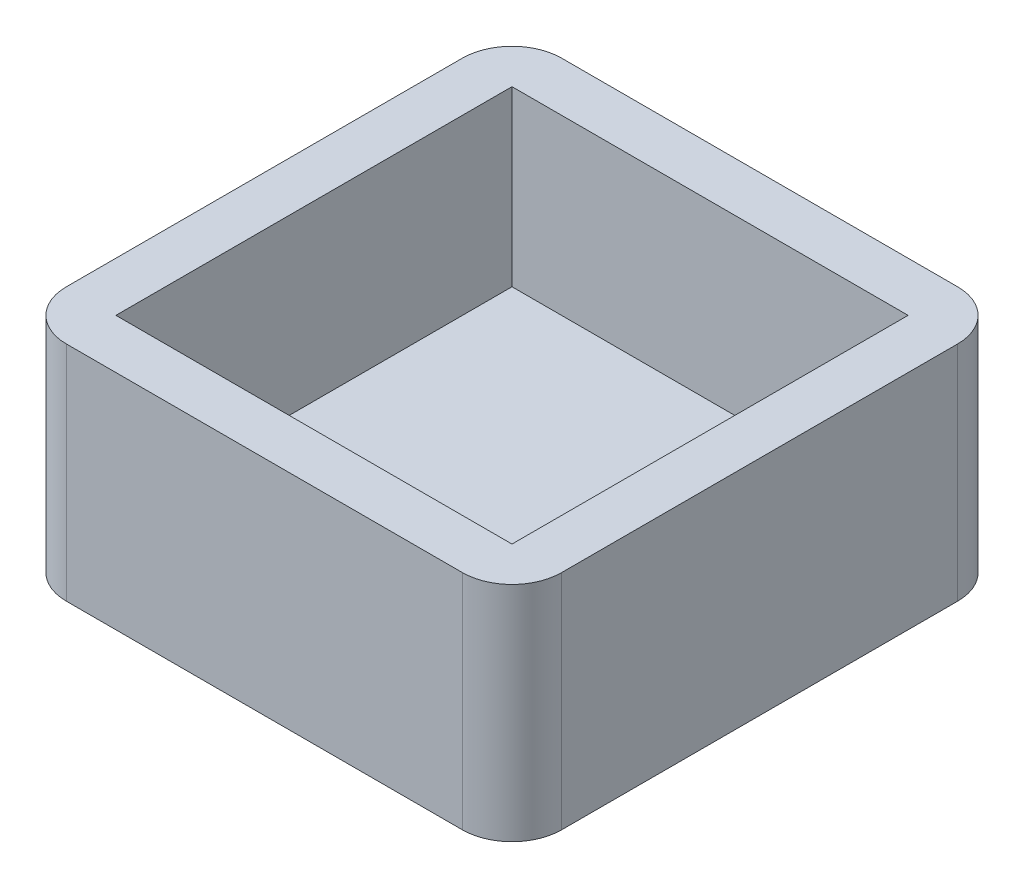
ISO-10303-21;
HEADER;
FILE_DESCRIPTION(('STEP AP214'),'2;1');
FILE_NAME('part.step','',(''),(''),'','','');
FILE_SCHEMA(('AUTOMOTIVE_DESIGN { 1 0 10303 214 1 1 1 1 }'));
ENDSEC;
DATA;
#1=APPLICATION_CONTEXT('core data for automotive mechanical design processes');
#2=APPLICATION_PROTOCOL_DEFINITION('international standard','automotive_design',2000,#1);
#3=PRODUCT_CONTEXT('',#1,'mechanical');
#4=PRODUCT('Part','Part','',(#3));
#5=PRODUCT_RELATED_PRODUCT_CATEGORY('part','',(#4));
#6=PRODUCT_DEFINITION_FORMATION('','',#4);
#7=PRODUCT_DEFINITION_CONTEXT('part definition',#1,'design');
#8=PRODUCT_DEFINITION('design','',#6,#7);
#9=PRODUCT_DEFINITION_SHAPE('','',#8);
#10=(LENGTH_UNIT() NAMED_UNIT(*) SI_UNIT(.MILLI.,.METRE.));
#11=(NAMED_UNIT(*) PLANE_ANGLE_UNIT() SI_UNIT($,.RADIAN.));
#12=(NAMED_UNIT(*) SI_UNIT($,.STERADIAN.) SOLID_ANGLE_UNIT());
#13=UNCERTAINTY_MEASURE_WITH_UNIT(LENGTH_MEASURE(1.E-05),#10,'distance_accuracy_value','');
#14=(GEOMETRIC_REPRESENTATION_CONTEXT(3) GLOBAL_UNCERTAINTY_ASSIGNED_CONTEXT((#13)) GLOBAL_UNIT_ASSIGNED_CONTEXT((#10,
#11,#12)) REPRESENTATION_CONTEXT('',''));
#15=CARTESIAN_POINT('',(0.,0.,0.));
#16=DIRECTION('',(0.,0.,1.));
#17=DIRECTION('',(1.,0.,0.));
#18=AXIS2_PLACEMENT_3D('',#15,#16,#17);
#19=CARTESIAN_POINT('',(0.,10.,0.));
#20=DIRECTION('',(1.,0.,0.));
#21=DIRECTION('',(0.,0.,-1.));
#22=AXIS2_PLACEMENT_3D('',#19,#20,#21);
#23=PLANE('',#22);
#24=DIRECTION('',(0.,0.,1.));
#25=VECTOR('',#24,1.);
#26=CARTESIAN_POINT('',(0.,45.,-100.));
#27=LINE('',#26,#25);
#28=CARTESIAN_POINT('',(0.,45.,-90.));
#29=VERTEX_POINT('',#28);
#30=CARTESIAN_POINT('',(0.,45.,-9.99999999999999));
#31=VERTEX_POINT('',#30);
#32=EDGE_CURVE('E178',#29,#31,#27,.T.);
#33=ORIENTED_EDGE('',*,*,#32,.F.);
#34=DIRECTION('',(0.,-1.,0.));
#35=VECTOR('',#34,1.);
#36=CARTESIAN_POINT('',(0.,10.,-90.));
#37=LINE('',#36,#35);
#38=CARTESIAN_POINT('',(0.,0.,-90.));
#39=VERTEX_POINT('',#38);
#40=EDGE_CURVE('E194',#29,#39,#37,.T.);
#41=ORIENTED_EDGE('',*,*,#40,.T.);
#42=DIRECTION('',(0.,0.,1.));
#43=VECTOR('',#42,1.);
#44=CARTESIAN_POINT('',(0.,0.,0.));
#45=LINE('',#44,#43);
#46=CARTESIAN_POINT('',(0.,0.,-10.));
#47=VERTEX_POINT('',#46);
#48=EDGE_CURVE('E181',#39,#47,#45,.T.);
#49=ORIENTED_EDGE('',*,*,#48,.T.);
#50=DIRECTION('',(0.,-1.,0.));
#51=VECTOR('',#50,1.);
#52=CARTESIAN_POINT('',(0.,10.,-10.));
#53=LINE('',#52,#51);
#54=EDGE_CURVE('E192',#47,#31,#53,.F.);
#55=ORIENTED_EDGE('',*,*,#54,.T.);
#56=EDGE_LOOP('',(#33,#41,#49,#55));
#57=FACE_BOUND('',#56,.T.);
#58=ADVANCED_FACE('F39',(#57),#23,.F.);
#59=CARTESIAN_POINT('',(0.,10.,0.));
#60=DIRECTION('',(0.,0.,-1.));
#61=DIRECTION('',(-1.,0.,0.));
#62=AXIS2_PLACEMENT_3D('',#59,#60,#61);
#63=PLANE('',#62);
#64=DIRECTION('',(1.,0.,0.));
#65=VECTOR('',#64,1.);
#66=CARTESIAN_POINT('',(0.,0.,0.));
#67=LINE('',#66,#65);
#68=CARTESIAN_POINT('',(10.,0.,0.));
#69=VERTEX_POINT('',#68);
#70=CARTESIAN_POINT('',(90.,0.,0.));
#71=VERTEX_POINT('',#70);
#72=EDGE_CURVE('E184',#69,#71,#67,.T.);
#73=ORIENTED_EDGE('',*,*,#72,.T.);
#74=DIRECTION('',(0.,-1.,0.));
#75=VECTOR('',#74,1.);
#76=CARTESIAN_POINT('',(90.,10.,0.));
#77=LINE('',#76,#75);
#78=CARTESIAN_POINT('',(90.,45.,0.));
#79=VERTEX_POINT('',#78);
#80=EDGE_CURVE('E11',#71,#79,#77,.F.);
#81=ORIENTED_EDGE('',*,*,#80,.T.);
#82=DIRECTION('',(1.,0.,0.));
#83=VECTOR('',#82,1.);
#84=CARTESIAN_POINT('',(0.,45.,0.));
#85=LINE('',#84,#83);
#86=CARTESIAN_POINT('',(10.,45.,0.));
#87=VERTEX_POINT('',#86);
#88=EDGE_CURVE('E148',#87,#79,#85,.T.);
#89=ORIENTED_EDGE('',*,*,#88,.F.);
#90=DIRECTION('',(0.,-1.,0.));
#91=VECTOR('',#90,1.);
#92=CARTESIAN_POINT('',(10.,10.,0.));
#93=LINE('',#92,#91);
#94=EDGE_CURVE('E47',#87,#69,#93,.T.);
#95=ORIENTED_EDGE('',*,*,#94,.T.);
#96=EDGE_LOOP('',(#73,#81,#89,#95));
#97=FACE_BOUND('',#96,.T.);
#98=ADVANCED_FACE('F225',(#97),#63,.F.);
#99=CARTESIAN_POINT('',(100.,10.,0.));
#100=DIRECTION('',(-1.,0.,0.));
#101=DIRECTION('',(0.,0.,1.));
#102=AXIS2_PLACEMENT_3D('',#99,#100,#101);
#103=PLANE('',#102);
#104=DIRECTION('',(0.,0.,-1.));
#105=VECTOR('',#104,1.);
#106=CARTESIAN_POINT('',(100.,0.,0.));
#107=LINE('',#106,#105);
#108=CARTESIAN_POINT('',(100.,0.,-10.));
#109=VERTEX_POINT('',#108);
#110=CARTESIAN_POINT('',(100.,0.,-90.));
#111=VERTEX_POINT('',#110);
#112=EDGE_CURVE('E187',#109,#111,#107,.T.);
#113=ORIENTED_EDGE('',*,*,#112,.T.);
#114=DIRECTION('',(0.,-1.,0.));
#115=VECTOR('',#114,1.);
#116=CARTESIAN_POINT('',(100.,10.,-90.));
#117=LINE('',#116,#115);
#118=CARTESIAN_POINT('',(100.,45.,-90.));
#119=VERTEX_POINT('',#118);
#120=EDGE_CURVE('E54',#111,#119,#117,.F.);
#121=ORIENTED_EDGE('',*,*,#120,.T.);
#122=DIRECTION('',(0.,0.,-1.));
#123=VECTOR('',#122,1.);
#124=CARTESIAN_POINT('',(100.,45.,0.));
#125=LINE('',#124,#123);
#126=CARTESIAN_POINT('',(100.,45.,-10.));
#127=VERTEX_POINT('',#126);
#128=EDGE_CURVE('E173',#127,#119,#125,.T.);
#129=ORIENTED_EDGE('',*,*,#128,.F.);
#130=DIRECTION('',(0.,-1.,0.));
#131=VECTOR('',#130,1.);
#132=CARTESIAN_POINT('',(100.,10.,-10.));
#133=LINE('',#132,#131);
#134=EDGE_CURVE('E217',#127,#109,#133,.T.);
#135=ORIENTED_EDGE('',*,*,#134,.T.);
#136=EDGE_LOOP('',(#113,#121,#129,#135));
#137=FACE_BOUND('',#136,.T.);
#138=ADVANCED_FACE('F236',(#137),#103,.F.);
#139=CARTESIAN_POINT('',(0.,10.,-100.));
#140=DIRECTION('',(0.,0.,1.));
#141=DIRECTION('',(1.,0.,0.));
#142=AXIS2_PLACEMENT_3D('',#139,#140,#141);
#143=PLANE('',#142);
#144=DIRECTION('',(-1.,0.,0.));
#145=VECTOR('',#144,1.);
#146=CARTESIAN_POINT('',(0.,0.,-100.));
#147=LINE('',#146,#145);
#148=CARTESIAN_POINT('',(90.,0.,-100.));
#149=VERTEX_POINT('',#148);
#150=CARTESIAN_POINT('',(10.,0.,-100.));
#151=VERTEX_POINT('',#150);
#152=EDGE_CURVE('E189',#149,#151,#147,.T.);
#153=ORIENTED_EDGE('',*,*,#152,.T.);
#154=DIRECTION('',(0.,-1.,0.));
#155=VECTOR('',#154,1.);
#156=CARTESIAN_POINT('',(10.,10.,-100.));
#157=LINE('',#156,#155);
#158=CARTESIAN_POINT('',(9.99999999999999,45.,-100.));
#159=VERTEX_POINT('',#158);
#160=EDGE_CURVE('E208',#151,#159,#157,.F.);
#161=ORIENTED_EDGE('',*,*,#160,.T.);
#162=DIRECTION('',(-1.,0.,0.));
#163=VECTOR('',#162,1.);
#164=CARTESIAN_POINT('',(100.,45.,-100.));
#165=LINE('',#164,#163);
#166=CARTESIAN_POINT('',(90.,45.,-100.));
#167=VERTEX_POINT('',#166);
#168=EDGE_CURVE('E175',#167,#159,#165,.T.);
#169=ORIENTED_EDGE('',*,*,#168,.F.);
#170=DIRECTION('',(0.,-1.,0.));
#171=VECTOR('',#170,1.);
#172=CARTESIAN_POINT('',(90.,10.,-100.));
#173=LINE('',#172,#171);
#174=EDGE_CURVE('E205',#167,#149,#173,.T.);
#175=ORIENTED_EDGE('',*,*,#174,.T.);
#176=EDGE_LOOP('',(#153,#161,#169,#175));
#177=FACE_BOUND('',#176,.T.);
#178=ADVANCED_FACE('F244',(#177),#143,.F.);
#179=CARTESIAN_POINT('',(0.,0.,0.));
#180=DIRECTION('',(0.,-1.,0.));
#181=DIRECTION('',(0.,0.,-1.));
#182=AXIS2_PLACEMENT_3D('',#179,#180,#181);
#183=PLANE('',#182);
#184=ORIENTED_EDGE('',*,*,#48,.F.);
#185=CARTESIAN_POINT('',(10.,0.,-90.));
#186=DIRECTION('',(0.,-1.,0.));
#187=DIRECTION('',(0.,0.,-1.));
#188=AXIS2_PLACEMENT_3D('',#185,#186,#187);
#189=CIRCLE('',#188,10.);
#190=EDGE_CURVE('E203',#39,#151,#189,.T.);
#191=ORIENTED_EDGE('',*,*,#190,.T.);
#192=ORIENTED_EDGE('',*,*,#152,.F.);
#193=CARTESIAN_POINT('',(90.,0.,-90.));
#194=DIRECTION('',(0.,-1.,0.));
#195=DIRECTION('',(0.,0.,-1.));
#196=AXIS2_PLACEMENT_3D('',#193,#194,#195);
#197=CIRCLE('',#196,10.);
#198=EDGE_CURVE('E201',#149,#111,#197,.T.);
#199=ORIENTED_EDGE('',*,*,#198,.T.);
#200=ORIENTED_EDGE('',*,*,#112,.F.);
#201=CARTESIAN_POINT('',(90.,0.,-10.));
#202=DIRECTION('',(0.,-1.,0.));
#203=DIRECTION('',(0.,0.,-1.));
#204=AXIS2_PLACEMENT_3D('',#201,#202,#203);
#205=CIRCLE('',#204,10.);
#206=EDGE_CURVE('E199',#109,#71,#205,.T.);
#207=ORIENTED_EDGE('',*,*,#206,.T.);
#208=ORIENTED_EDGE('',*,*,#72,.F.);
#209=CARTESIAN_POINT('',(10.,0.,-10.));
#210=DIRECTION('',(0.,-1.,0.));
#211=DIRECTION('',(0.,0.,-1.));
#212=AXIS2_PLACEMENT_3D('',#209,#210,#211);
#213=CIRCLE('',#212,10.);
#214=EDGE_CURVE('E197',#69,#47,#213,.T.);
#215=ORIENTED_EDGE('',*,*,#214,.T.);
#216=EDGE_LOOP('',(#184,#191,#192,#199,#200,#207,#208,#215));
#217=FACE_BOUND('',#216,.T.);
#218=ADVANCED_FACE('F231',(#217),#183,.T.);
#219=CARTESIAN_POINT('',(0.,45.,0.));
#220=DIRECTION('',(0.,1.,0.));
#221=DIRECTION('',(0.,0.,1.));
#222=AXIS2_PLACEMENT_3D('',#219,#220,#221);
#223=PLANE('',#222);
#224=ORIENTED_EDGE('',*,*,#168,.T.);
#225=CARTESIAN_POINT('',(10.,45.,-90.));
#226=DIRECTION('',(0.,1.,0.));
#227=DIRECTION('',(0.,0.,1.));
#228=AXIS2_PLACEMENT_3D('',#225,#226,#227);
#229=CIRCLE('',#228,10.);
#230=EDGE_CURVE('E215',#159,#29,#229,.T.);
#231=ORIENTED_EDGE('',*,*,#230,.T.);
#232=ORIENTED_EDGE('',*,*,#32,.T.);
#233=CARTESIAN_POINT('',(10.,45.,-10.));
#234=DIRECTION('',(0.,1.,0.));
#235=DIRECTION('',(0.,0.,1.));
#236=AXIS2_PLACEMENT_3D('',#233,#234,#235);
#237=CIRCLE('',#236,10.);
#238=EDGE_CURVE('E210',#31,#87,#237,.T.);
#239=ORIENTED_EDGE('',*,*,#238,.T.);
#240=ORIENTED_EDGE('',*,*,#88,.T.);
#241=CARTESIAN_POINT('',(90.,45.,-10.));
#242=DIRECTION('',(0.,1.,0.));
#243=DIRECTION('',(0.,0.,1.));
#244=AXIS2_PLACEMENT_3D('',#241,#242,#243);
#245=CIRCLE('',#244,10.);
#246=EDGE_CURVE('E61',#79,#127,#245,.T.);
#247=ORIENTED_EDGE('',*,*,#246,.T.);
#248=ORIENTED_EDGE('',*,*,#128,.T.);
#249=CARTESIAN_POINT('',(90.,45.,-90.));
#250=DIRECTION('',(0.,1.,0.));
#251=DIRECTION('',(0.,0.,1.));
#252=AXIS2_PLACEMENT_3D('',#249,#250,#251);
#253=CIRCLE('',#252,10.);
#254=EDGE_CURVE('E213',#119,#167,#253,.T.);
#255=ORIENTED_EDGE('',*,*,#254,.T.);
#256=EDGE_LOOP('',(#224,#231,#232,#239,#240,#247,#248,#255));
#257=FACE_BOUND('',#256,.T.);
#258=DIRECTION('',(0.,0.,-1.));
#259=VECTOR('',#258,1.);
#260=CARTESIAN_POINT('',(90.,45.,-10.));
#261=LINE('',#260,#259);
#262=CARTESIAN_POINT('',(90.,45.,-10.));
#263=VERTEX_POINT('',#262);
#264=CARTESIAN_POINT('',(90.,45.,-90.));
#265=VERTEX_POINT('',#264);
#266=EDGE_CURVE('E140',#263,#265,#261,.T.);
#267=ORIENTED_EDGE('',*,*,#266,.F.);
#268=DIRECTION('',(1.,0.,0.));
#269=VECTOR('',#268,1.);
#270=CARTESIAN_POINT('',(10.,45.,-10.));
#271=LINE('',#270,#269);
#272=CARTESIAN_POINT('',(10.,45.,-10.));
#273=VERTEX_POINT('',#272);
#274=EDGE_CURVE('E130',#273,#263,#271,.T.);
#275=ORIENTED_EDGE('',*,*,#274,.F.);
#276=DIRECTION('',(0.,0.,1.));
#277=VECTOR('',#276,1.);
#278=CARTESIAN_POINT('',(10.,45.,-90.));
#279=LINE('',#278,#277);
#280=CARTESIAN_POINT('',(10.,45.,-90.));
#281=VERTEX_POINT('',#280);
#282=EDGE_CURVE('E156',#281,#273,#279,.T.);
#283=ORIENTED_EDGE('',*,*,#282,.F.);
#284=DIRECTION('',(-1.,0.,0.));
#285=VECTOR('',#284,1.);
#286=CARTESIAN_POINT('',(90.,45.,-90.));
#287=LINE('',#286,#285);
#288=EDGE_CURVE('E154',#265,#281,#287,.T.);
#289=ORIENTED_EDGE('',*,*,#288,.F.);
#290=EDGE_LOOP('',(#267,#275,#283,#289));
#291=FACE_BOUND('',#290,.T.);
#292=ADVANCED_FACE('F152',(#257,#291),#223,.T.);
#293=CARTESIAN_POINT('',(10.,45.,-10.));
#294=DIRECTION('',(0.,0.,-1.));
#295=DIRECTION('',(-1.,0.,0.));
#296=AXIS2_PLACEMENT_3D('',#293,#294,#295);
#297=PLANE('',#296);
#298=DIRECTION('',(1.,0.,0.));
#299=VECTOR('',#298,1.);
#300=CARTESIAN_POINT('',(10.,10.,-10.));
#301=LINE('',#300,#299);
#302=CARTESIAN_POINT('',(10.,10.,-10.));
#303=VERTEX_POINT('',#302);
#304=CARTESIAN_POINT('',(90.,10.,-10.));
#305=VERTEX_POINT('',#304);
#306=EDGE_CURVE('E160',#303,#305,#301,.T.);
#307=ORIENTED_EDGE('',*,*,#306,.F.);
#308=DIRECTION('',(0.,-1.,0.));
#309=VECTOR('',#308,1.);
#310=CARTESIAN_POINT('',(10.,45.,-10.));
#311=LINE('',#310,#309);
#312=EDGE_CURVE('E136',#273,#303,#311,.T.);
#313=ORIENTED_EDGE('',*,*,#312,.F.);
#314=ORIENTED_EDGE('',*,*,#274,.T.);
#315=DIRECTION('',(0.,-1.,0.));
#316=VECTOR('',#315,1.);
#317=CARTESIAN_POINT('',(90.,45.,-10.));
#318=LINE('',#317,#316);
#319=EDGE_CURVE('E134',#263,#305,#318,.T.);
#320=ORIENTED_EDGE('',*,*,#319,.T.);
#321=EDGE_LOOP('',(#307,#313,#314,#320));
#322=FACE_BOUND('',#321,.T.);
#323=ADVANCED_FACE('F133',(#322),#297,.T.);
#324=CARTESIAN_POINT('',(90.,45.,-10.));
#325=DIRECTION('',(-1.,0.,0.));
#326=DIRECTION('',(0.,0.,1.));
#327=AXIS2_PLACEMENT_3D('',#324,#325,#326);
#328=PLANE('',#327);
#329=DIRECTION('',(0.,0.,-1.));
#330=VECTOR('',#329,1.);
#331=CARTESIAN_POINT('',(90.,10.,-10.));
#332=LINE('',#331,#330);
#333=CARTESIAN_POINT('',(90.,10.,-90.));
#334=VERTEX_POINT('',#333);
#335=EDGE_CURVE('E147',#305,#334,#332,.T.);
#336=ORIENTED_EDGE('',*,*,#335,.F.);
#337=ORIENTED_EDGE('',*,*,#319,.F.);
#338=ORIENTED_EDGE('',*,*,#266,.T.);
#339=DIRECTION('',(0.,-1.,0.));
#340=VECTOR('',#339,1.);
#341=CARTESIAN_POINT('',(90.,45.,-90.));
#342=LINE('',#341,#340);
#343=EDGE_CURVE('E149',#265,#334,#342,.T.);
#344=ORIENTED_EDGE('',*,*,#343,.T.);
#345=EDGE_LOOP('',(#336,#337,#338,#344));
#346=FACE_BOUND('',#345,.T.);
#347=ADVANCED_FACE('F144',(#346),#328,.T.);
#348=CARTESIAN_POINT('',(90.,45.,-90.));
#349=DIRECTION('',(0.,0.,1.));
#350=DIRECTION('',(1.,0.,0.));
#351=AXIS2_PLACEMENT_3D('',#348,#349,#350);
#352=PLANE('',#351);
#353=DIRECTION('',(-1.,0.,0.));
#354=VECTOR('',#353,1.);
#355=CARTESIAN_POINT('',(90.,10.,-90.));
#356=LINE('',#355,#354);
#357=CARTESIAN_POINT('',(10.,10.,-90.));
#358=VERTEX_POINT('',#357);
#359=EDGE_CURVE('E163',#334,#358,#356,.T.);
#360=ORIENTED_EDGE('',*,*,#359,.F.);
#361=ORIENTED_EDGE('',*,*,#343,.F.);
#362=ORIENTED_EDGE('',*,*,#288,.T.);
#363=DIRECTION('',(0.,-1.,0.));
#364=VECTOR('',#363,1.);
#365=CARTESIAN_POINT('',(10.,45.,-90.));
#366=LINE('',#365,#364);
#367=EDGE_CURVE('E169',#281,#358,#366,.T.);
#368=ORIENTED_EDGE('',*,*,#367,.T.);
#369=EDGE_LOOP('',(#360,#361,#362,#368));
#370=FACE_BOUND('',#369,.T.);
#371=ADVANCED_FACE('F299',(#370),#352,.T.);
#372=CARTESIAN_POINT('',(10.,45.,-90.));
#373=DIRECTION('',(1.,0.,0.));
#374=DIRECTION('',(0.,0.,-1.));
#375=AXIS2_PLACEMENT_3D('',#372,#373,#374);
#376=PLANE('',#375);
#377=DIRECTION('',(0.,0.,1.));
#378=VECTOR('',#377,1.);
#379=CARTESIAN_POINT('',(10.,10.,-90.));
#380=LINE('',#379,#378);
#381=EDGE_CURVE('E141',#358,#303,#380,.T.);
#382=ORIENTED_EDGE('',*,*,#381,.F.);
#383=ORIENTED_EDGE('',*,*,#367,.F.);
#384=ORIENTED_EDGE('',*,*,#282,.T.);
#385=ORIENTED_EDGE('',*,*,#312,.T.);
#386=EDGE_LOOP('',(#382,#383,#384,#385));
#387=FACE_BOUND('',#386,.T.);
#388=ADVANCED_FACE('F295',(#387),#376,.T.);
#389=CARTESIAN_POINT('',(0.,10.,0.));
#390=DIRECTION('',(0.,-1.,0.));
#391=DIRECTION('',(0.,0.,-1.));
#392=AXIS2_PLACEMENT_3D('',#389,#390,#391);
#393=PLANE('',#392);
#394=ORIENTED_EDGE('',*,*,#381,.T.);
#395=ORIENTED_EDGE('',*,*,#306,.T.);
#396=ORIENTED_EDGE('',*,*,#335,.T.);
#397=ORIENTED_EDGE('',*,*,#359,.T.);
#398=EDGE_LOOP('',(#394,#395,#396,#397));
#399=FACE_BOUND('',#398,.T.);
#400=ADVANCED_FACE('F268',(#399),#393,.F.);
#401=CARTESIAN_POINT('',(10.,10.,-90.));
#402=DIRECTION('',(0.,-1.,0.));
#403=DIRECTION('',(0.,0.,-1.));
#404=AXIS2_PLACEMENT_3D('',#401,#402,#403);
#405=CYLINDRICAL_SURFACE('',#404,10.);
#406=ORIENTED_EDGE('',*,*,#230,.F.);
#407=ORIENTED_EDGE('',*,*,#160,.F.);
#408=ORIENTED_EDGE('',*,*,#190,.F.);
#409=ORIENTED_EDGE('',*,*,#40,.F.);
#410=EDGE_LOOP('',(#406,#407,#408,#409));
#411=FACE_BOUND('',#410,.T.);
#412=ADVANCED_FACE('F249',(#411),#405,.T.);
#413=CARTESIAN_POINT('',(90.,10.,-90.));
#414=DIRECTION('',(0.,-1.,0.));
#415=DIRECTION('',(0.,0.,-1.));
#416=AXIS2_PLACEMENT_3D('',#413,#414,#415);
#417=CYLINDRICAL_SURFACE('',#416,10.);
#418=ORIENTED_EDGE('',*,*,#254,.F.);
#419=ORIENTED_EDGE('',*,*,#120,.F.);
#420=ORIENTED_EDGE('',*,*,#198,.F.);
#421=ORIENTED_EDGE('',*,*,#174,.F.);
#422=EDGE_LOOP('',(#418,#419,#420,#421));
#423=FACE_BOUND('',#422,.T.);
#424=ADVANCED_FACE('F241',(#423),#417,.T.);
#425=CARTESIAN_POINT('',(90.,10.,-10.));
#426=DIRECTION('',(0.,-1.,0.));
#427=DIRECTION('',(0.,0.,-1.));
#428=AXIS2_PLACEMENT_3D('',#425,#426,#427);
#429=CYLINDRICAL_SURFACE('',#428,10.);
#430=ORIENTED_EDGE('',*,*,#246,.F.);
#431=ORIENTED_EDGE('',*,*,#80,.F.);
#432=ORIENTED_EDGE('',*,*,#206,.F.);
#433=ORIENTED_EDGE('',*,*,#134,.F.);
#434=EDGE_LOOP('',(#430,#431,#432,#433));
#435=FACE_BOUND('',#434,.T.);
#436=ADVANCED_FACE('F235',(#435),#429,.T.);
#437=CARTESIAN_POINT('',(10.,10.,-10.));
#438=DIRECTION('',(0.,-1.,0.));
#439=DIRECTION('',(0.,0.,-1.));
#440=AXIS2_PLACEMENT_3D('',#437,#438,#439);
#441=CYLINDRICAL_SURFACE('',#440,10.);
#442=ORIENTED_EDGE('',*,*,#238,.F.);
#443=ORIENTED_EDGE('',*,*,#54,.F.);
#444=ORIENTED_EDGE('',*,*,#214,.F.);
#445=ORIENTED_EDGE('',*,*,#94,.F.);
#446=EDGE_LOOP('',(#442,#443,#444,#445));
#447=FACE_BOUND('',#446,.T.);
#448=ADVANCED_FACE('F41',(#447),#441,.T.);
#449=CLOSED_SHELL('',(#58,#98,#138,#178,#218,#292,#323,#347,#371,#388,#400,#412,#424,#436,#448));
#450=MANIFOLD_SOLID_BREP('B2',#449);
#451=ADVANCED_BREP_SHAPE_REPRESENTATION('',(#18,#450),#14);
#452=SHAPE_DEFINITION_REPRESENTATION(#9,#451);
ENDSEC;
END-ISO-10303-21;
